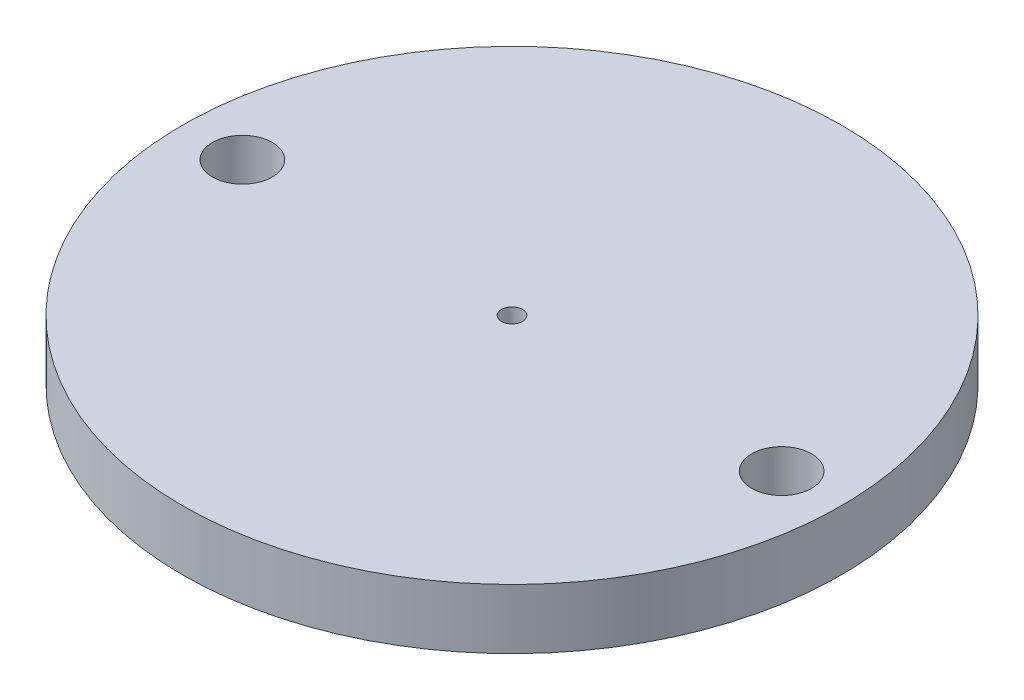
ISO-10303-21;
HEADER;
FILE_DESCRIPTION(('STEP AP214'),'2;1');
FILE_NAME('part.step','',(''),(''),'','','');
FILE_SCHEMA(('AUTOMOTIVE_DESIGN { 1 0 10303 214 1 1 1 1 }'));
ENDSEC;
DATA;
#1=APPLICATION_CONTEXT('core data for automotive mechanical design processes');
#2=APPLICATION_PROTOCOL_DEFINITION('international standard','automotive_design',2000,#1);
#3=PRODUCT_CONTEXT('',#1,'mechanical');
#4=PRODUCT('Part','Part','',(#3));
#5=PRODUCT_RELATED_PRODUCT_CATEGORY('part','',(#4));
#6=PRODUCT_DEFINITION_FORMATION('','',#4);
#7=PRODUCT_DEFINITION_CONTEXT('part definition',#1,'design');
#8=PRODUCT_DEFINITION('design','',#6,#7);
#9=PRODUCT_DEFINITION_SHAPE('','',#8);
#10=(LENGTH_UNIT() NAMED_UNIT(*) SI_UNIT(.MILLI.,.METRE.));
#11=(NAMED_UNIT(*) PLANE_ANGLE_UNIT() SI_UNIT($,.RADIAN.));
#12=(NAMED_UNIT(*) SI_UNIT($,.STERADIAN.) SOLID_ANGLE_UNIT());
#13=UNCERTAINTY_MEASURE_WITH_UNIT(LENGTH_MEASURE(1.E-05),#10,'distance_accuracy_value','');
#14=(GEOMETRIC_REPRESENTATION_CONTEXT(3) GLOBAL_UNCERTAINTY_ASSIGNED_CONTEXT((#13)) GLOBAL_UNIT_ASSIGNED_CONTEXT((#10,
#11,#12)) REPRESENTATION_CONTEXT('',''));
#15=CARTESIAN_POINT('',(0.,0.,0.));
#16=DIRECTION('',(0.,0.,1.));
#17=DIRECTION('',(1.,0.,0.));
#18=AXIS2_PLACEMENT_3D('',#15,#16,#17);
#19=CARTESIAN_POINT('',(0.,10.,0.));
#20=DIRECTION('',(0.,1.,0.));
#21=DIRECTION('',(0.,0.,1.));
#22=AXIS2_PLACEMENT_3D('',#19,#20,#21);
#23=PLANE('',#22);
#24=CARTESIAN_POINT('',(-45.,10.,0.));
#25=DIRECTION('',(0.,1.,0.));
#26=DIRECTION('',(0.,0.,1.));
#27=AXIS2_PLACEMENT_3D('',#24,#25,#26);
#28=CIRCLE('',#27,5.);
#29=CARTESIAN_POINT('',(-45.,10.,5.));
#30=VERTEX_POINT('',#29);
#31=EDGE_CURVE('E62',#30,#30,#28,.T.);
#32=ORIENTED_EDGE('',*,*,#31,.F.);
#33=EDGE_LOOP('',(#32));
#34=FACE_BOUND('',#33,.T.);
#35=CARTESIAN_POINT('',(0.,10.,0.));
#36=DIRECTION('',(0.,1.,0.));
#37=DIRECTION('',(0.,0.,1.));
#38=AXIS2_PLACEMENT_3D('',#35,#36,#37);
#39=CIRCLE('',#38,55.);
#40=CARTESIAN_POINT('',(0.,10.,55.));
#41=VERTEX_POINT('',#40);
#42=EDGE_CURVE('E10',#41,#41,#39,.T.);
#43=ORIENTED_EDGE('',*,*,#42,.T.);
#44=EDGE_LOOP('',(#43));
#45=FACE_BOUND('',#44,.T.);
#46=CARTESIAN_POINT('',(0.,10.,0.));
#47=DIRECTION('',(0.,1.,0.));
#48=DIRECTION('',(0.,0.,1.));
#49=AXIS2_PLACEMENT_3D('',#46,#47,#48);
#50=CIRCLE('',#49,1.75);
#51=CARTESIAN_POINT('',(0.,10.,1.75));
#52=VERTEX_POINT('',#51);
#53=EDGE_CURVE('E56',#52,#52,#50,.T.);
#54=ORIENTED_EDGE('',*,*,#53,.F.);
#55=EDGE_LOOP('',(#54));
#56=FACE_BOUND('',#55,.T.);
#57=CARTESIAN_POINT('',(45.,10.,0.));
#58=DIRECTION('',(0.,1.,0.));
#59=DIRECTION('',(0.,0.,-1.));
#60=AXIS2_PLACEMENT_3D('',#57,#58,#59);
#61=CIRCLE('',#60,5.);
#62=CARTESIAN_POINT('',(45.,10.,-5.));
#63=VERTEX_POINT('',#62);
#64=EDGE_CURVE('E70',#63,#63,#61,.T.);
#65=ORIENTED_EDGE('',*,*,#64,.F.);
#66=EDGE_LOOP('',(#65));
#67=FACE_BOUND('',#66,.T.);
#68=ADVANCED_FACE('F43',(#34,#45,#56,#67),#23,.T.);
#69=CARTESIAN_POINT('',(0.,0.,0.));
#70=DIRECTION('',(0.,1.,0.));
#71=DIRECTION('',(0.,0.,1.));
#72=AXIS2_PLACEMENT_3D('',#69,#70,#71);
#73=PLANE('',#72);
#74=CARTESIAN_POINT('',(0.,0.,0.));
#75=DIRECTION('',(0.,1.,0.));
#76=DIRECTION('',(0.,0.,1.));
#77=AXIS2_PLACEMENT_3D('',#74,#75,#76);
#78=CIRCLE('',#77,55.);
#79=CARTESIAN_POINT('',(0.,0.,55.));
#80=VERTEX_POINT('',#79);
#81=EDGE_CURVE('E47',#80,#80,#78,.T.);
#82=ORIENTED_EDGE('',*,*,#81,.F.);
#83=EDGE_LOOP('',(#82));
#84=FACE_BOUND('',#83,.T.);
#85=CARTESIAN_POINT('',(0.,0.,0.));
#86=DIRECTION('',(0.,1.,0.));
#87=DIRECTION('',(0.,0.,1.));
#88=AXIS2_PLACEMENT_3D('',#85,#86,#87);
#89=CIRCLE('',#88,1.75);
#90=CARTESIAN_POINT('',(0.,0.,1.75));
#91=VERTEX_POINT('',#90);
#92=EDGE_CURVE('E58',#91,#91,#89,.T.);
#93=ORIENTED_EDGE('',*,*,#92,.T.);
#94=EDGE_LOOP('',(#93));
#95=FACE_BOUND('',#94,.T.);
#96=CARTESIAN_POINT('',(-45.,0.,0.));
#97=DIRECTION('',(0.,1.,0.));
#98=DIRECTION('',(0.,0.,1.));
#99=AXIS2_PLACEMENT_3D('',#96,#97,#98);
#100=CIRCLE('',#99,5.);
#101=CARTESIAN_POINT('',(-45.,0.,5.));
#102=VERTEX_POINT('',#101);
#103=EDGE_CURVE('E66',#102,#102,#100,.T.);
#104=ORIENTED_EDGE('',*,*,#103,.T.);
#105=EDGE_LOOP('',(#104));
#106=FACE_BOUND('',#105,.T.);
#107=CARTESIAN_POINT('',(45.,0.,0.));
#108=DIRECTION('',(0.,1.,0.));
#109=DIRECTION('',(0.,0.,-1.));
#110=AXIS2_PLACEMENT_3D('',#107,#108,#109);
#111=CIRCLE('',#110,5.);
#112=CARTESIAN_POINT('',(45.,0.,-5.));
#113=VERTEX_POINT('',#112);
#114=EDGE_CURVE('E74',#113,#113,#111,.T.);
#115=ORIENTED_EDGE('',*,*,#114,.T.);
#116=EDGE_LOOP('',(#115));
#117=FACE_BOUND('',#116,.T.);
#118=ADVANCED_FACE('F86',(#84,#95,#106,#117),#73,.F.);
#119=CARTESIAN_POINT('',(0.,10.,0.));
#120=DIRECTION('',(0.,-1.,0.));
#121=DIRECTION('',(0.,0.,-1.));
#122=AXIS2_PLACEMENT_3D('',#119,#120,#121);
#123=CYLINDRICAL_SURFACE('',#122,55.);
#124=ORIENTED_EDGE('',*,*,#42,.F.);
#125=EDGE_LOOP('',(#124));
#126=FACE_BOUND('',#125,.T.);
#127=ORIENTED_EDGE('',*,*,#81,.T.);
#128=EDGE_LOOP('',(#127));
#129=FACE_BOUND('',#128,.T.);
#130=ADVANCED_FACE('F45',(#126,#129),#123,.T.);
#131=CARTESIAN_POINT('',(0.,10.,0.));
#132=DIRECTION('',(0.,-1.,0.));
#133=DIRECTION('',(0.,0.,-1.));
#134=AXIS2_PLACEMENT_3D('',#131,#132,#133);
#135=CYLINDRICAL_SURFACE('',#134,1.75);
#136=ORIENTED_EDGE('',*,*,#53,.T.);
#137=EDGE_LOOP('',(#136));
#138=FACE_BOUND('',#137,.T.);
#139=ORIENTED_EDGE('',*,*,#92,.F.);
#140=EDGE_LOOP('',(#139));
#141=FACE_BOUND('',#140,.T.);
#142=ADVANCED_FACE('F95',(#138,#141),#135,.F.);
#143=CARTESIAN_POINT('',(-45.,10.,0.));
#144=DIRECTION('',(0.,-1.,0.));
#145=DIRECTION('',(0.,0.,-1.));
#146=AXIS2_PLACEMENT_3D('',#143,#144,#145);
#147=CYLINDRICAL_SURFACE('',#146,5.);
#148=ORIENTED_EDGE('',*,*,#31,.T.);
#149=EDGE_LOOP('',(#148));
#150=FACE_BOUND('',#149,.T.);
#151=ORIENTED_EDGE('',*,*,#103,.F.);
#152=EDGE_LOOP('',(#151));
#153=FACE_BOUND('',#152,.T.);
#154=ADVANCED_FACE('F98',(#150,#153),#147,.F.);
#155=CARTESIAN_POINT('',(45.,10.,0.));
#156=DIRECTION('',(0.,-1.,0.));
#157=DIRECTION('',(0.,0.,-1.));
#158=AXIS2_PLACEMENT_3D('',#155,#156,#157);
#159=CYLINDRICAL_SURFACE('',#158,5.);
#160=ORIENTED_EDGE('',*,*,#64,.T.);
#161=EDGE_LOOP('',(#160));
#162=FACE_BOUND('',#161,.T.);
#163=ORIENTED_EDGE('',*,*,#114,.F.);
#164=EDGE_LOOP('',(#163));
#165=FACE_BOUND('',#164,.T.);
#166=ADVANCED_FACE('F82',(#162,#165),#159,.F.);
#167=CLOSED_SHELL('',(#68,#118,#130,#142,#154,#166));
#168=MANIFOLD_SOLID_BREP('B2',#167);
#169=ADVANCED_BREP_SHAPE_REPRESENTATION('',(#18,#168),#14);
#170=SHAPE_DEFINITION_REPRESENTATION(#9,#169);
ENDSEC;
END-ISO-10303-21;
